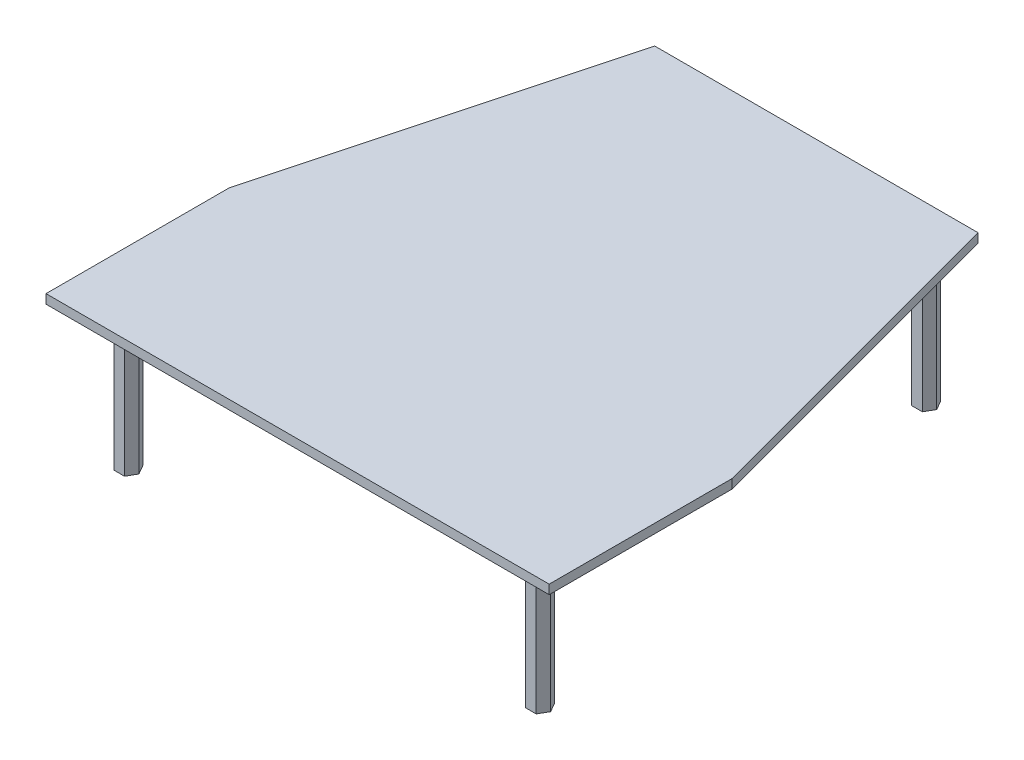
ISO-10303-21;
HEADER;
FILE_DESCRIPTION(('STEP AP214'),'2;1');
FILE_NAME('part.step','',(''),(''),'','','');
FILE_SCHEMA(('AUTOMOTIVE_DESIGN { 1 0 10303 214 1 1 1 1 }'));
ENDSEC;
DATA;
#1=APPLICATION_CONTEXT('core data for automotive mechanical design processes');
#2=APPLICATION_PROTOCOL_DEFINITION('international standard','automotive_design',2000,#1);
#3=PRODUCT_CONTEXT('',#1,'mechanical');
#4=PRODUCT('Part','Part','',(#3));
#5=PRODUCT_RELATED_PRODUCT_CATEGORY('part','',(#4));
#6=PRODUCT_DEFINITION_FORMATION('','',#4);
#7=PRODUCT_DEFINITION_CONTEXT('part definition',#1,'design');
#8=PRODUCT_DEFINITION('design','',#6,#7);
#9=PRODUCT_DEFINITION_SHAPE('','',#8);
#10=(LENGTH_UNIT() NAMED_UNIT(*) SI_UNIT(.MILLI.,.METRE.));
#11=(NAMED_UNIT(*) PLANE_ANGLE_UNIT() SI_UNIT($,.RADIAN.));
#12=(NAMED_UNIT(*) SI_UNIT($,.STERADIAN.) SOLID_ANGLE_UNIT());
#13=UNCERTAINTY_MEASURE_WITH_UNIT(LENGTH_MEASURE(1.E-05),#10,'distance_accuracy_value','');
#14=(GEOMETRIC_REPRESENTATION_CONTEXT(3) GLOBAL_UNCERTAINTY_ASSIGNED_CONTEXT((#13)) GLOBAL_UNIT_ASSIGNED_CONTEXT((#10,
#11,#12)) REPRESENTATION_CONTEXT('',''));
#15=CARTESIAN_POINT('',(0.,0.,0.));
#16=DIRECTION('',(0.,0.,1.));
#17=DIRECTION('',(1.,0.,0.));
#18=AXIS2_PLACEMENT_3D('',#15,#16,#17);
#19=CARTESIAN_POINT('',(0.,-1.,0.));
#20=DIRECTION('',(0.,-1.,0.));
#21=DIRECTION('',(0.,0.,-1.));
#22=AXIS2_PLACEMENT_3D('',#19,#20,#21);
#23=PLANE('',#22);
#24=DIRECTION('',(-0.258819045102522,0.,0.965925826289068));
#25=VECTOR('',#24,1.);
#26=CARTESIAN_POINT('',(-55.,-1.,-40.));
#27=LINE('',#26,#25);
#28=CARTESIAN_POINT('',(-35.3297525722084,-1.,-113.410362797969));
#29=VERTEX_POINT('',#28);
#30=CARTESIAN_POINT('',(-55.,-1.,-40.));
#31=VERTEX_POINT('',#30);
#32=EDGE_CURVE('E391',#29,#31,#27,.T.);
#33=ORIENTED_EDGE('',*,*,#32,.F.);
#34=DIRECTION('',(-1.,0.,0.));
#35=VECTOR('',#34,1.);
#36=CARTESIAN_POINT('',(-35.3297525722084,-1.,-113.410362797969));
#37=LINE('',#36,#35);
#38=CARTESIAN_POINT('',(35.3297525722084,-1.,-113.410362797969));
#39=VERTEX_POINT('',#38);
#40=EDGE_CURVE('E396',#39,#29,#37,.T.);
#41=ORIENTED_EDGE('',*,*,#40,.F.);
#42=DIRECTION('',(-0.258819045102522,0.,-0.965925826289068));
#43=VECTOR('',#42,1.);
#44=CARTESIAN_POINT('',(55.,-1.,-40.));
#45=LINE('',#44,#43);
#46=CARTESIAN_POINT('',(55.,-1.,-40.));
#47=VERTEX_POINT('',#46);
#48=EDGE_CURVE('E415',#47,#39,#45,.T.);
#49=ORIENTED_EDGE('',*,*,#48,.F.);
#50=DIRECTION('',(0.,0.,-1.));
#51=VECTOR('',#50,1.);
#52=CARTESIAN_POINT('',(55.,-1.,0.));
#53=LINE('',#52,#51);
#54=CARTESIAN_POINT('',(55.,-1.,0.));
#55=VERTEX_POINT('',#54);
#56=EDGE_CURVE('E413',#55,#47,#53,.T.);
#57=ORIENTED_EDGE('',*,*,#56,.F.);
#58=DIRECTION('',(1.,0.,0.));
#59=VECTOR('',#58,1.);
#60=CARTESIAN_POINT('',(-55.,-1.,0.));
#61=LINE('',#60,#59);
#62=CARTESIAN_POINT('',(-55.,-1.,0.));
#63=VERTEX_POINT('',#62);
#64=EDGE_CURVE('E411',#63,#55,#61,.T.);
#65=ORIENTED_EDGE('',*,*,#64,.F.);
#66=DIRECTION('',(0.,0.,1.));
#67=VECTOR('',#66,1.);
#68=CARTESIAN_POINT('',(-55.,-1.,0.));
#69=LINE('',#68,#67);
#70=EDGE_CURVE('E409',#31,#63,#69,.T.);
#71=ORIENTED_EDGE('',*,*,#70,.F.);
#72=EDGE_LOOP('',(#33,#41,#49,#57,#65,#71));
#73=FACE_BOUND('',#72,.T.);
#74=DIRECTION('',(-0.5,0.,0.866025403784439));
#75=VECTOR('',#74,1.);
#76=CARTESIAN_POINT('',(-42.6905989232415,-1.,-7.99999999999999));
#77=LINE('',#76,#75);
#78=CARTESIAN_POINT('',(-42.6905989232415,-1.,-7.99999999999999));
#79=VERTEX_POINT('',#78);
#80=CARTESIAN_POINT('',(-43.8452994616208,-1.,-5.99999999999997));
#81=VERTEX_POINT('',#80);
#82=EDGE_CURVE('E366',#79,#81,#77,.T.);
#83=ORIENTED_EDGE('',*,*,#82,.F.);
#84=DIRECTION('',(0.499999999999998,0.,0.86602540378444));
#85=VECTOR('',#84,1.);
#86=CARTESIAN_POINT('',(-43.8452994616208,-1.,-9.99999999999999));
#87=LINE('',#86,#85);
#88=CARTESIAN_POINT('',(-43.8452994616208,-1.,-9.99999999999999));
#89=VERTEX_POINT('',#88);
#90=EDGE_CURVE('E348',#89,#79,#87,.T.);
#91=ORIENTED_EDGE('',*,*,#90,.F.);
#92=DIRECTION('',(1.,0.,0.));
#93=VECTOR('',#92,1.);
#94=CARTESIAN_POINT('',(-46.1547005383793,-1.,-10.));
#95=LINE('',#94,#93);
#96=CARTESIAN_POINT('',(-46.1547005383793,-1.,-10.));
#97=VERTEX_POINT('',#96);
#98=EDGE_CURVE('E353',#97,#89,#95,.T.);
#99=ORIENTED_EDGE('',*,*,#98,.F.);
#100=DIRECTION('',(0.499999999999995,0.,-0.866025403784441));
#101=VECTOR('',#100,1.);
#102=CARTESIAN_POINT('',(-47.3094010767585,-1.,-7.99999999999999));
#103=LINE('',#102,#101);
#104=CARTESIAN_POINT('',(-47.3094010767585,-1.,-7.99999999999999));
#105=VERTEX_POINT('',#104);
#106=EDGE_CURVE('E372',#105,#97,#103,.T.);
#107=ORIENTED_EDGE('',*,*,#106,.F.);
#108=DIRECTION('',(-0.499999999999992,0.,-0.866025403784443));
#109=VECTOR('',#108,1.);
#110=CARTESIAN_POINT('',(-46.1547005383793,-1.,-5.99999999999998));
#111=LINE('',#110,#109);
#112=CARTESIAN_POINT('',(-46.1547005383793,-1.,-5.99999999999998));
#113=VERTEX_POINT('',#112);
#114=EDGE_CURVE('E370',#113,#105,#111,.T.);
#115=ORIENTED_EDGE('',*,*,#114,.F.);
#116=DIRECTION('',(-1.,0.,0.));
#117=VECTOR('',#116,1.);
#118=CARTESIAN_POINT('',(-43.8452994616208,-1.,-5.99999999999997));
#119=LINE('',#118,#117);
#120=EDGE_CURVE('E368',#81,#113,#119,.T.);
#121=ORIENTED_EDGE('',*,*,#120,.F.);
#122=EDGE_LOOP('',(#83,#91,#99,#107,#115,#121));
#123=FACE_BOUND('',#122,.T.);
#124=DIRECTION('',(-0.5,0.,0.866025403784439));
#125=VECTOR('',#124,1.);
#126=CARTESIAN_POINT('',(-27.6905989232415,-1.,-107.410362797969));
#127=LINE('',#126,#125);
#128=CARTESIAN_POINT('',(-27.6905989232415,-1.,-107.410362797969));
#129=VERTEX_POINT('',#128);
#130=CARTESIAN_POINT('',(-28.8452994616208,-1.,-105.410362797969));
#131=VERTEX_POINT('',#130);
#132=EDGE_CURVE('E323',#129,#131,#127,.T.);
#133=ORIENTED_EDGE('',*,*,#132,.F.);
#134=DIRECTION('',(0.500000000000001,0.,0.866025403784438));
#135=VECTOR('',#134,1.);
#136=CARTESIAN_POINT('',(-28.8452994616207,-1.,-109.410362797969));
#137=LINE('',#136,#135);
#138=CARTESIAN_POINT('',(-28.8452994616207,-1.,-109.410362797969));
#139=VERTEX_POINT('',#138);
#140=EDGE_CURVE('E305',#139,#129,#137,.T.);
#141=ORIENTED_EDGE('',*,*,#140,.F.);
#142=DIRECTION('',(1.,0.,0.));
#143=VECTOR('',#142,1.);
#144=CARTESIAN_POINT('',(-31.1547005383793,-1.,-109.410362797969));
#145=LINE('',#144,#143);
#146=CARTESIAN_POINT('',(-31.1547005383793,-1.,-109.410362797969));
#147=VERTEX_POINT('',#146);
#148=EDGE_CURVE('E310',#147,#139,#145,.T.);
#149=ORIENTED_EDGE('',*,*,#148,.F.);
#150=DIRECTION('',(0.5,0.,-0.866025403784439));
#151=VECTOR('',#150,1.);
#152=CARTESIAN_POINT('',(-32.3094010767585,-1.,-107.410362797969));
#153=LINE('',#152,#151);
#154=CARTESIAN_POINT('',(-32.3094010767585,-1.,-107.410362797969));
#155=VERTEX_POINT('',#154);
#156=EDGE_CURVE('E329',#155,#147,#153,.T.);
#157=ORIENTED_EDGE('',*,*,#156,.F.);
#158=DIRECTION('',(-0.5,0.,-0.866025403784439));
#159=VECTOR('',#158,1.);
#160=CARTESIAN_POINT('',(-31.1547005383793,-1.,-105.410362797969));
#161=LINE('',#160,#159);
#162=CARTESIAN_POINT('',(-31.1547005383793,-1.,-105.410362797969));
#163=VERTEX_POINT('',#162);
#164=EDGE_CURVE('E327',#163,#155,#161,.T.);
#165=ORIENTED_EDGE('',*,*,#164,.F.);
#166=DIRECTION('',(-1.,0.,0.));
#167=VECTOR('',#166,1.);
#168=CARTESIAN_POINT('',(-28.8452994616208,-1.,-105.410362797969));
#169=LINE('',#168,#167);
#170=EDGE_CURVE('E325',#131,#163,#169,.T.);
#171=ORIENTED_EDGE('',*,*,#170,.F.);
#172=EDGE_LOOP('',(#133,#141,#149,#157,#165,#171));
#173=FACE_BOUND('',#172,.T.);
#174=DIRECTION('',(0.5,0.,0.866025403784439));
#175=VECTOR('',#174,1.);
#176=CARTESIAN_POINT('',(32.3094010767585,-1.,-107.410362797969));
#177=LINE('',#176,#175);
#178=CARTESIAN_POINT('',(31.1547005383793,-1.,-109.410362797969));
#179=VERTEX_POINT('',#178);
#180=CARTESIAN_POINT('',(32.3094010767585,-1.,-107.410362797969));
#181=VERTEX_POINT('',#180);
#182=EDGE_CURVE('E262',#179,#181,#177,.T.);
#183=ORIENTED_EDGE('',*,*,#182,.F.);
#184=DIRECTION('',(1.,0.,0.));
#185=VECTOR('',#184,1.);
#186=CARTESIAN_POINT('',(31.1547005383793,-1.,-109.410362797969));
#187=LINE('',#186,#185);
#188=CARTESIAN_POINT('',(28.8452994616207,-1.,-109.410362797969));
#189=VERTEX_POINT('',#188);
#190=EDGE_CURVE('E259',#189,#179,#187,.T.);
#191=ORIENTED_EDGE('',*,*,#190,.F.);
#192=DIRECTION('',(0.500000000000001,0.,-0.866025403784438));
#193=VECTOR('',#192,1.);
#194=CARTESIAN_POINT('',(28.8452994616207,-1.,-109.410362797969));
#195=LINE('',#194,#193);
#196=CARTESIAN_POINT('',(27.6905989232415,-1.,-107.410362797969));
#197=VERTEX_POINT('',#196);
#198=EDGE_CURVE('E272',#197,#189,#195,.T.);
#199=ORIENTED_EDGE('',*,*,#198,.F.);
#200=DIRECTION('',(-0.5,0.,-0.866025403784439));
#201=VECTOR('',#200,1.);
#202=CARTESIAN_POINT('',(27.6905989232415,-1.,-107.410362797969));
#203=LINE('',#202,#201);
#204=CARTESIAN_POINT('',(28.8452994616208,-1.,-105.410362797969));
#205=VERTEX_POINT('',#204);
#206=EDGE_CURVE('E288',#205,#197,#203,.T.);
#207=ORIENTED_EDGE('',*,*,#206,.F.);
#208=DIRECTION('',(-1.,0.,0.));
#209=VECTOR('',#208,1.);
#210=CARTESIAN_POINT('',(28.8452994616208,-1.,-105.410362797969));
#211=LINE('',#210,#209);
#212=CARTESIAN_POINT('',(31.1547005383793,-1.,-105.410362797969));
#213=VERTEX_POINT('',#212);
#214=EDGE_CURVE('E286',#213,#205,#211,.T.);
#215=ORIENTED_EDGE('',*,*,#214,.F.);
#216=DIRECTION('',(-0.5,0.,0.866025403784439));
#217=VECTOR('',#216,1.);
#218=CARTESIAN_POINT('',(31.1547005383793,-1.,-105.410362797969));
#219=LINE('',#218,#217);
#220=EDGE_CURVE('E284',#181,#213,#219,.T.);
#221=ORIENTED_EDGE('',*,*,#220,.F.);
#222=EDGE_LOOP('',(#183,#191,#199,#207,#215,#221));
#223=FACE_BOUND('',#222,.T.);
#224=DIRECTION('',(0.499999999999995,0.,0.866025403784441));
#225=VECTOR('',#224,1.);
#226=CARTESIAN_POINT('',(47.3094010767585,-1.,-7.99999999999999));
#227=LINE('',#226,#225);
#228=CARTESIAN_POINT('',(46.1547005383793,-1.,-9.99999999999999));
#229=VERTEX_POINT('',#228);
#230=CARTESIAN_POINT('',(47.3094010767585,-1.,-7.99999999999999));
#231=VERTEX_POINT('',#230);
#232=EDGE_CURVE('E802',#229,#231,#227,.T.);
#233=ORIENTED_EDGE('',*,*,#232,.F.);
#234=DIRECTION('',(1.,0.,0.));
#235=VECTOR('',#234,1.);
#236=CARTESIAN_POINT('',(46.1547005383793,-1.,-9.99999999999999));
#237=LINE('',#236,#235);
#238=CARTESIAN_POINT('',(43.8452994616208,-1.,-9.99999999999999));
#239=VERTEX_POINT('',#238);
#240=EDGE_CURVE('E257',#239,#229,#237,.T.);
#241=ORIENTED_EDGE('',*,*,#240,.F.);
#242=DIRECTION('',(0.499999999999998,0.,-0.86602540378444));
#243=VECTOR('',#242,1.);
#244=CARTESIAN_POINT('',(43.8452994616208,-1.,-9.99999999999999));
#245=LINE('',#244,#243);
#246=CARTESIAN_POINT('',(42.6905989232415,-1.,-7.99999999999999));
#247=VERTEX_POINT('',#246);
#248=EDGE_CURVE('E253',#247,#239,#245,.T.);
#249=ORIENTED_EDGE('',*,*,#248,.F.);
#250=DIRECTION('',(-0.500000000000001,0.,-0.866025403784438));
#251=VECTOR('',#250,1.);
#252=CARTESIAN_POINT('',(42.6905989232415,-1.,-7.99999999999999));
#253=LINE('',#252,#251);
#254=CARTESIAN_POINT('',(43.8452994616208,-1.,-5.99999999999997));
#255=VERTEX_POINT('',#254);
#256=EDGE_CURVE('E798',#255,#247,#253,.T.);
#257=ORIENTED_EDGE('',*,*,#256,.F.);
#258=DIRECTION('',(-1.,0.,0.));
#259=VECTOR('',#258,1.);
#260=CARTESIAN_POINT('',(43.8452994616208,-1.,-5.99999999999997));
#261=LINE('',#260,#259);
#262=CARTESIAN_POINT('',(46.1547005383793,-1.,-5.99999999999997));
#263=VERTEX_POINT('',#262);
#264=EDGE_CURVE('E810',#263,#255,#261,.T.);
#265=ORIENTED_EDGE('',*,*,#264,.F.);
#266=DIRECTION('',(-0.499999999999993,0.,0.866025403784443));
#267=VECTOR('',#266,1.);
#268=CARTESIAN_POINT('',(46.1547005383793,-1.,-5.99999999999997));
#269=LINE('',#268,#267);
#270=EDGE_CURVE('E804',#231,#263,#269,.T.);
#271=ORIENTED_EDGE('',*,*,#270,.F.);
#272=EDGE_LOOP('',(#233,#241,#249,#257,#265,#271));
#273=FACE_BOUND('',#272,.T.);
#274=ADVANCED_FACE('F36',(#73,#123,#173,#223,#273),#23,.T.);
#275=CARTESIAN_POINT('',(-55.,1.,-40.));
#276=DIRECTION('',(0.965925826289068,0.,0.258819045102522));
#277=DIRECTION('',(0.258819045102522,0.,-0.965925826289068));
#278=AXIS2_PLACEMENT_3D('',#275,#276,#277);
#279=PLANE('',#278);
#280=ORIENTED_EDGE('',*,*,#32,.T.);
#281=DIRECTION('',(0.,-1.,0.));
#282=VECTOR('',#281,1.);
#283=CARTESIAN_POINT('',(-55.,1.,-40.));
#284=LINE('',#283,#282);
#285=CARTESIAN_POINT('',(-55.,1.,-40.));
#286=VERTEX_POINT('',#285);
#287=EDGE_CURVE('E11',#286,#31,#284,.T.);
#288=ORIENTED_EDGE('',*,*,#287,.F.);
#289=DIRECTION('',(-0.258819045102522,0.,0.965925826289068));
#290=VECTOR('',#289,1.);
#291=CARTESIAN_POINT('',(-55.,1.,-40.));
#292=LINE('',#291,#290);
#293=CARTESIAN_POINT('',(-35.3297525722084,1.,-113.410362797969));
#294=VERTEX_POINT('',#293);
#295=EDGE_CURVE('E392',#294,#286,#292,.T.);
#296=ORIENTED_EDGE('',*,*,#295,.F.);
#297=DIRECTION('',(0.,-1.,0.));
#298=VECTOR('',#297,1.);
#299=CARTESIAN_POINT('',(-35.3297525722084,1.,-113.410362797969));
#300=LINE('',#299,#298);
#301=EDGE_CURVE('E406',#294,#29,#300,.T.);
#302=ORIENTED_EDGE('',*,*,#301,.T.);
#303=EDGE_LOOP('',(#280,#288,#296,#302));
#304=FACE_BOUND('',#303,.T.);
#305=ADVANCED_FACE('F38',(#304),#279,.F.);
#306=CARTESIAN_POINT('',(-55.,1.,0.));
#307=DIRECTION('',(1.,0.,0.));
#308=DIRECTION('',(0.,0.,-1.));
#309=AXIS2_PLACEMENT_3D('',#306,#307,#308);
#310=PLANE('',#309);
#311=ORIENTED_EDGE('',*,*,#70,.T.);
#312=DIRECTION('',(0.,-1.,0.));
#313=VECTOR('',#312,1.);
#314=CARTESIAN_POINT('',(-55.,1.,0.));
#315=LINE('',#314,#313);
#316=CARTESIAN_POINT('',(-55.,1.,0.));
#317=VERTEX_POINT('',#316);
#318=EDGE_CURVE('E44',#317,#63,#315,.T.);
#319=ORIENTED_EDGE('',*,*,#318,.F.);
#320=DIRECTION('',(0.,0.,1.));
#321=VECTOR('',#320,1.);
#322=CARTESIAN_POINT('',(-55.,1.,0.));
#323=LINE('',#322,#321);
#324=EDGE_CURVE('E395',#286,#317,#323,.T.);
#325=ORIENTED_EDGE('',*,*,#324,.F.);
#326=ORIENTED_EDGE('',*,*,#287,.T.);
#327=EDGE_LOOP('',(#311,#319,#325,#326));
#328=FACE_BOUND('',#327,.T.);
#329=ADVANCED_FACE('F456',(#328),#310,.F.);
#330=CARTESIAN_POINT('',(-55.,1.,0.));
#331=DIRECTION('',(0.,0.,-1.));
#332=DIRECTION('',(-1.,0.,0.));
#333=AXIS2_PLACEMENT_3D('',#330,#331,#332);
#334=PLANE('',#333);
#335=ORIENTED_EDGE('',*,*,#64,.T.);
#336=DIRECTION('',(0.,-1.,0.));
#337=VECTOR('',#336,1.);
#338=CARTESIAN_POINT('',(55.,1.,0.));
#339=LINE('',#338,#337);
#340=CARTESIAN_POINT('',(55.,1.,0.));
#341=VERTEX_POINT('',#340);
#342=EDGE_CURVE('E426',#341,#55,#339,.T.);
#343=ORIENTED_EDGE('',*,*,#342,.F.);
#344=DIRECTION('',(1.,0.,0.));
#345=VECTOR('',#344,1.);
#346=CARTESIAN_POINT('',(-55.,1.,0.));
#347=LINE('',#346,#345);
#348=EDGE_CURVE('E398',#317,#341,#347,.T.);
#349=ORIENTED_EDGE('',*,*,#348,.F.);
#350=ORIENTED_EDGE('',*,*,#318,.T.);
#351=EDGE_LOOP('',(#335,#343,#349,#350));
#352=FACE_BOUND('',#351,.T.);
#353=ADVANCED_FACE('F433',(#352),#334,.F.);
#354=CARTESIAN_POINT('',(55.,1.,0.));
#355=DIRECTION('',(-1.,0.,0.));
#356=DIRECTION('',(0.,0.,1.));
#357=AXIS2_PLACEMENT_3D('',#354,#355,#356);
#358=PLANE('',#357);
#359=ORIENTED_EDGE('',*,*,#56,.T.);
#360=DIRECTION('',(0.,-1.,0.));
#361=VECTOR('',#360,1.);
#362=CARTESIAN_POINT('',(55.,1.,-40.));
#363=LINE('',#362,#361);
#364=CARTESIAN_POINT('',(55.,1.,-40.));
#365=VERTEX_POINT('',#364);
#366=EDGE_CURVE('E423',#365,#47,#363,.T.);
#367=ORIENTED_EDGE('',*,*,#366,.F.);
#368=DIRECTION('',(0.,0.,-1.));
#369=VECTOR('',#368,1.);
#370=CARTESIAN_POINT('',(55.,1.,0.));
#371=LINE('',#370,#369);
#372=EDGE_CURVE('E400',#341,#365,#371,.T.);
#373=ORIENTED_EDGE('',*,*,#372,.F.);
#374=ORIENTED_EDGE('',*,*,#342,.T.);
#375=EDGE_LOOP('',(#359,#367,#373,#374));
#376=FACE_BOUND('',#375,.T.);
#377=ADVANCED_FACE('F444',(#376),#358,.F.);
#378=CARTESIAN_POINT('',(55.,1.,-40.));
#379=DIRECTION('',(-0.965925826289068,0.,0.258819045102522));
#380=DIRECTION('',(0.258819045102522,0.,0.965925826289068));
#381=AXIS2_PLACEMENT_3D('',#378,#379,#380);
#382=PLANE('',#381);
#383=ORIENTED_EDGE('',*,*,#48,.T.);
#384=DIRECTION('',(0.,-1.,0.));
#385=VECTOR('',#384,1.);
#386=CARTESIAN_POINT('',(35.3297525722084,1.,-113.410362797969));
#387=LINE('',#386,#385);
#388=CARTESIAN_POINT('',(35.3297525722084,1.,-113.410362797969));
#389=VERTEX_POINT('',#388);
#390=EDGE_CURVE('E420',#389,#39,#387,.T.);
#391=ORIENTED_EDGE('',*,*,#390,.F.);
#392=DIRECTION('',(-0.258819045102522,0.,-0.965925826289068));
#393=VECTOR('',#392,1.);
#394=CARTESIAN_POINT('',(55.,1.,-40.));
#395=LINE('',#394,#393);
#396=EDGE_CURVE('E402',#365,#389,#395,.T.);
#397=ORIENTED_EDGE('',*,*,#396,.F.);
#398=ORIENTED_EDGE('',*,*,#366,.T.);
#399=EDGE_LOOP('',(#383,#391,#397,#398));
#400=FACE_BOUND('',#399,.T.);
#401=ADVANCED_FACE('F448',(#400),#382,.F.);
#402=CARTESIAN_POINT('',(-35.3297525722084,1.,-113.410362797969));
#403=DIRECTION('',(0.,0.,1.));
#404=DIRECTION('',(1.,0.,0.));
#405=AXIS2_PLACEMENT_3D('',#402,#403,#404);
#406=PLANE('',#405);
#407=ORIENTED_EDGE('',*,*,#40,.T.);
#408=ORIENTED_EDGE('',*,*,#301,.F.);
#409=DIRECTION('',(-1.,0.,0.));
#410=VECTOR('',#409,1.);
#411=CARTESIAN_POINT('',(-35.3297525722084,1.,-113.410362797969));
#412=LINE('',#411,#410);
#413=EDGE_CURVE('E404',#389,#294,#412,.T.);
#414=ORIENTED_EDGE('',*,*,#413,.F.);
#415=ORIENTED_EDGE('',*,*,#390,.T.);
#416=EDGE_LOOP('',(#407,#408,#414,#415));
#417=FACE_BOUND('',#416,.T.);
#418=ADVANCED_FACE('F459',(#417),#406,.F.);
#419=CARTESIAN_POINT('',(0.,1.,0.));
#420=DIRECTION('',(0.,-1.,0.));
#421=DIRECTION('',(0.,0.,-1.));
#422=AXIS2_PLACEMENT_3D('',#419,#420,#421);
#423=PLANE('',#422);
#424=ORIENTED_EDGE('',*,*,#295,.T.);
#425=ORIENTED_EDGE('',*,*,#324,.T.);
#426=ORIENTED_EDGE('',*,*,#348,.T.);
#427=ORIENTED_EDGE('',*,*,#372,.T.);
#428=ORIENTED_EDGE('',*,*,#396,.T.);
#429=ORIENTED_EDGE('',*,*,#413,.T.);
#430=EDGE_LOOP('',(#424,#425,#426,#427,#428,#429));
#431=FACE_BOUND('',#430,.T.);
#432=ADVANCED_FACE('F452',(#431),#423,.F.);
#433=CARTESIAN_POINT('',(-43.8452994616208,-31.,-9.99999999999999));
#434=DIRECTION('',(-0.86602540378444,0.,0.499999999999998));
#435=DIRECTION('',(0.499999999999998,0.,0.86602540378444));
#436=AXIS2_PLACEMENT_3D('',#433,#434,#435);
#437=PLANE('',#436);
#438=ORIENTED_EDGE('',*,*,#90,.T.);
#439=DIRECTION('',(0.,1.,0.));
#440=VECTOR('',#439,1.);
#441=CARTESIAN_POINT('',(-42.6905989232415,-31.,-7.99999999999999));
#442=LINE('',#441,#440);
#443=CARTESIAN_POINT('',(-42.6905989232415,-31.,-7.99999999999999));
#444=VERTEX_POINT('',#443);
#445=EDGE_CURVE('E389',#444,#79,#442,.T.);
#446=ORIENTED_EDGE('',*,*,#445,.F.);
#447=DIRECTION('',(0.499999999999998,0.,0.86602540378444));
#448=VECTOR('',#447,1.);
#449=CARTESIAN_POINT('',(-43.8452994616208,-31.,-9.99999999999999));
#450=LINE('',#449,#448);
#451=CARTESIAN_POINT('',(-43.8452994616208,-31.,-9.99999999999999));
#452=VERTEX_POINT('',#451);
#453=EDGE_CURVE('E349',#452,#444,#450,.T.);
#454=ORIENTED_EDGE('',*,*,#453,.F.);
#455=DIRECTION('',(0.,1.,0.));
#456=VECTOR('',#455,1.);
#457=CARTESIAN_POINT('',(-43.8452994616208,-31.,-9.99999999999999));
#458=LINE('',#457,#456);
#459=EDGE_CURVE('E363',#452,#89,#458,.T.);
#460=ORIENTED_EDGE('',*,*,#459,.T.);
#461=EDGE_LOOP('',(#438,#446,#454,#460));
#462=FACE_BOUND('',#461,.T.);
#463=ADVANCED_FACE('F466',(#462),#437,.F.);
#464=CARTESIAN_POINT('',(-42.6905989232415,-31.,-7.99999999999999));
#465=DIRECTION('',(-0.866025403784438,0.,-0.5));
#466=DIRECTION('',(-0.5,0.,0.866025403784439));
#467=AXIS2_PLACEMENT_3D('',#464,#465,#466);
#468=PLANE('',#467);
#469=ORIENTED_EDGE('',*,*,#82,.T.);
#470=DIRECTION('',(0.,1.,0.));
#471=VECTOR('',#470,1.);
#472=CARTESIAN_POINT('',(-43.8452994616208,-31.,-5.99999999999997));
#473=LINE('',#472,#471);
#474=CARTESIAN_POINT('',(-43.8452994616208,-31.,-5.99999999999997));
#475=VERTEX_POINT('',#474);
#476=EDGE_CURVE('E386',#475,#81,#473,.T.);
#477=ORIENTED_EDGE('',*,*,#476,.F.);
#478=DIRECTION('',(-0.5,0.,0.866025403784439));
#479=VECTOR('',#478,1.);
#480=CARTESIAN_POINT('',(-42.6905989232415,-31.,-7.99999999999999));
#481=LINE('',#480,#479);
#482=EDGE_CURVE('E352',#444,#475,#481,.T.);
#483=ORIENTED_EDGE('',*,*,#482,.F.);
#484=ORIENTED_EDGE('',*,*,#445,.T.);
#485=EDGE_LOOP('',(#469,#477,#483,#484));
#486=FACE_BOUND('',#485,.T.);
#487=ADVANCED_FACE('F477',(#486),#468,.F.);
#488=CARTESIAN_POINT('',(-43.8452994616208,-31.,-5.99999999999997));
#489=DIRECTION('',(0.,0.,-1.));
#490=DIRECTION('',(-1.,0.,0.));
#491=AXIS2_PLACEMENT_3D('',#488,#489,#490);
#492=PLANE('',#491);
#493=ORIENTED_EDGE('',*,*,#120,.T.);
#494=DIRECTION('',(0.,1.,0.));
#495=VECTOR('',#494,1.);
#496=CARTESIAN_POINT('',(-46.1547005383793,-31.,-5.99999999999998));
#497=LINE('',#496,#495);
#498=CARTESIAN_POINT('',(-46.1547005383793,-31.,-5.99999999999998));
#499=VERTEX_POINT('',#498);
#500=EDGE_CURVE('E383',#499,#113,#497,.T.);
#501=ORIENTED_EDGE('',*,*,#500,.F.);
#502=DIRECTION('',(-1.,0.,0.));
#503=VECTOR('',#502,1.);
#504=CARTESIAN_POINT('',(-43.8452994616208,-31.,-5.99999999999997));
#505=LINE('',#504,#503);
#506=EDGE_CURVE('E355',#475,#499,#505,.T.);
#507=ORIENTED_EDGE('',*,*,#506,.F.);
#508=ORIENTED_EDGE('',*,*,#476,.T.);
#509=EDGE_LOOP('',(#493,#501,#507,#508));
#510=FACE_BOUND('',#509,.T.);
#511=ADVANCED_FACE('F481',(#510),#492,.F.);
#512=CARTESIAN_POINT('',(-46.1547005383793,-31.,-5.99999999999998));
#513=DIRECTION('',(0.866025403784443,0.,-0.499999999999992));
#514=DIRECTION('',(-0.499999999999992,0.,-0.866025403784443));
#515=AXIS2_PLACEMENT_3D('',#512,#513,#514);
#516=PLANE('',#515);
#517=ORIENTED_EDGE('',*,*,#114,.T.);
#518=DIRECTION('',(0.,1.,0.));
#519=VECTOR('',#518,1.);
#520=CARTESIAN_POINT('',(-47.3094010767585,-31.,-7.99999999999999));
#521=LINE('',#520,#519);
#522=CARTESIAN_POINT('',(-47.3094010767585,-31.,-7.99999999999999));
#523=VERTEX_POINT('',#522);
#524=EDGE_CURVE('E380',#523,#105,#521,.T.);
#525=ORIENTED_EDGE('',*,*,#524,.F.);
#526=DIRECTION('',(-0.499999999999992,0.,-0.866025403784443));
#527=VECTOR('',#526,1.);
#528=CARTESIAN_POINT('',(-46.1547005383793,-31.,-5.99999999999998));
#529=LINE('',#528,#527);
#530=EDGE_CURVE('E357',#499,#523,#529,.T.);
#531=ORIENTED_EDGE('',*,*,#530,.F.);
#532=ORIENTED_EDGE('',*,*,#500,.T.);
#533=EDGE_LOOP('',(#517,#525,#531,#532));
#534=FACE_BOUND('',#533,.T.);
#535=ADVANCED_FACE('F485',(#534),#516,.F.);
#536=CARTESIAN_POINT('',(-47.3094010767585,-31.,-7.99999999999999));
#537=DIRECTION('',(0.866025403784441,0.,0.499999999999995));
#538=DIRECTION('',(0.499999999999995,0.,-0.866025403784442));
#539=AXIS2_PLACEMENT_3D('',#536,#537,#538);
#540=PLANE('',#539);
#541=ORIENTED_EDGE('',*,*,#106,.T.);
#542=DIRECTION('',(0.,1.,0.));
#543=VECTOR('',#542,1.);
#544=CARTESIAN_POINT('',(-46.1547005383793,-31.,-10.));
#545=LINE('',#544,#543);
#546=CARTESIAN_POINT('',(-46.1547005383793,-31.,-10.));
#547=VERTEX_POINT('',#546);
#548=EDGE_CURVE('E378',#547,#97,#545,.T.);
#549=ORIENTED_EDGE('',*,*,#548,.F.);
#550=DIRECTION('',(0.499999999999995,0.,-0.866025403784441));
#551=VECTOR('',#550,1.);
#552=CARTESIAN_POINT('',(-47.3094010767585,-31.,-7.99999999999999));
#553=LINE('',#552,#551);
#554=EDGE_CURVE('E359',#523,#547,#553,.T.);
#555=ORIENTED_EDGE('',*,*,#554,.F.);
#556=ORIENTED_EDGE('',*,*,#524,.T.);
#557=EDGE_LOOP('',(#541,#549,#555,#556));
#558=FACE_BOUND('',#557,.T.);
#559=ADVANCED_FACE('F489',(#558),#540,.F.);
#560=CARTESIAN_POINT('',(-46.1547005383793,-31.,-10.));
#561=DIRECTION('',(0.,0.,1.));
#562=DIRECTION('',(1.,0.,0.));
#563=AXIS2_PLACEMENT_3D('',#560,#561,#562);
#564=PLANE('',#563);
#565=ORIENTED_EDGE('',*,*,#98,.T.);
#566=ORIENTED_EDGE('',*,*,#459,.F.);
#567=DIRECTION('',(1.,0.,0.));
#568=VECTOR('',#567,1.);
#569=CARTESIAN_POINT('',(-46.1547005383793,-31.,-10.));
#570=LINE('',#569,#568);
#571=EDGE_CURVE('E361',#547,#452,#570,.T.);
#572=ORIENTED_EDGE('',*,*,#571,.F.);
#573=ORIENTED_EDGE('',*,*,#548,.T.);
#574=EDGE_LOOP('',(#565,#566,#572,#573));
#575=FACE_BOUND('',#574,.T.);
#576=ADVANCED_FACE('F493',(#575),#564,.F.);
#577=CARTESIAN_POINT('',(0.,-31.,0.));
#578=DIRECTION('',(0.,-1.,0.));
#579=DIRECTION('',(0.,0.,-1.));
#580=AXIS2_PLACEMENT_3D('',#577,#578,#579);
#581=PLANE('',#580);
#582=ORIENTED_EDGE('',*,*,#453,.T.);
#583=ORIENTED_EDGE('',*,*,#482,.T.);
#584=ORIENTED_EDGE('',*,*,#506,.T.);
#585=ORIENTED_EDGE('',*,*,#530,.T.);
#586=ORIENTED_EDGE('',*,*,#554,.T.);
#587=ORIENTED_EDGE('',*,*,#571,.T.);
#588=EDGE_LOOP('',(#582,#583,#584,#585,#586,#587));
#589=FACE_BOUND('',#588,.T.);
#590=ADVANCED_FACE('F497',(#589),#581,.T.);
#591=CARTESIAN_POINT('',(-28.8452994616207,-31.,-109.410362797969));
#592=DIRECTION('',(-0.866025403784438,0.,0.500000000000001));
#593=DIRECTION('',(0.500000000000001,0.,0.866025403784438));
#594=AXIS2_PLACEMENT_3D('',#591,#592,#593);
#595=PLANE('',#594);
#596=ORIENTED_EDGE('',*,*,#140,.T.);
#597=DIRECTION('',(0.,1.,0.));
#598=VECTOR('',#597,1.);
#599=CARTESIAN_POINT('',(-27.6905989232415,-31.,-107.410362797969));
#600=LINE('',#599,#598);
#601=CARTESIAN_POINT('',(-27.6905989232415,-31.,-107.410362797969));
#602=VERTEX_POINT('',#601);
#603=EDGE_CURVE('E346',#602,#129,#600,.T.);
#604=ORIENTED_EDGE('',*,*,#603,.F.);
#605=DIRECTION('',(0.500000000000001,0.,0.866025403784438));
#606=VECTOR('',#605,1.);
#607=CARTESIAN_POINT('',(-28.8452994616207,-31.,-109.410362797969));
#608=LINE('',#607,#606);
#609=CARTESIAN_POINT('',(-28.8452994616207,-31.,-109.410362797969));
#610=VERTEX_POINT('',#609);
#611=EDGE_CURVE('E306',#610,#602,#608,.T.);
#612=ORIENTED_EDGE('',*,*,#611,.F.);
#613=DIRECTION('',(0.,1.,0.));
#614=VECTOR('',#613,1.);
#615=CARTESIAN_POINT('',(-28.8452994616207,-31.,-109.410362797969));
#616=LINE('',#615,#614);
#617=EDGE_CURVE('E320',#610,#139,#616,.T.);
#618=ORIENTED_EDGE('',*,*,#617,.T.);
#619=EDGE_LOOP('',(#596,#604,#612,#618));
#620=FACE_BOUND('',#619,.T.);
#621=ADVANCED_FACE('F501',(#620),#595,.F.);
#622=CARTESIAN_POINT('',(-27.6905989232415,-31.,-107.410362797969));
#623=DIRECTION('',(-0.866025403784439,0.,-0.5));
#624=DIRECTION('',(-0.5,0.,0.866025403784439));
#625=AXIS2_PLACEMENT_3D('',#622,#623,#624);
#626=PLANE('',#625);
#627=ORIENTED_EDGE('',*,*,#132,.T.);
#628=DIRECTION('',(0.,1.,0.));
#629=VECTOR('',#628,1.);
#630=CARTESIAN_POINT('',(-28.8452994616208,-31.,-105.410362797969));
#631=LINE('',#630,#629);
#632=CARTESIAN_POINT('',(-28.8452994616208,-31.,-105.410362797969));
#633=VERTEX_POINT('',#632);
#634=EDGE_CURVE('E343',#633,#131,#631,.T.);
#635=ORIENTED_EDGE('',*,*,#634,.F.);
#636=DIRECTION('',(-0.5,0.,0.866025403784439));
#637=VECTOR('',#636,1.);
#638=CARTESIAN_POINT('',(-27.6905989232415,-31.,-107.410362797969));
#639=LINE('',#638,#637);
#640=EDGE_CURVE('E309',#602,#633,#639,.T.);
#641=ORIENTED_EDGE('',*,*,#640,.F.);
#642=ORIENTED_EDGE('',*,*,#603,.T.);
#643=EDGE_LOOP('',(#627,#635,#641,#642));
#644=FACE_BOUND('',#643,.T.);
#645=ADVANCED_FACE('F505',(#644),#626,.F.);
#646=CARTESIAN_POINT('',(-28.8452994616208,-31.,-105.410362797969));
#647=DIRECTION('',(0.,0.,-1.));
#648=DIRECTION('',(-1.,0.,0.));
#649=AXIS2_PLACEMENT_3D('',#646,#647,#648);
#650=PLANE('',#649);
#651=ORIENTED_EDGE('',*,*,#170,.T.);
#652=DIRECTION('',(0.,1.,0.));
#653=VECTOR('',#652,1.);
#654=CARTESIAN_POINT('',(-31.1547005383793,-31.,-105.410362797969));
#655=LINE('',#654,#653);
#656=CARTESIAN_POINT('',(-31.1547005383793,-31.,-105.410362797969));
#657=VERTEX_POINT('',#656);
#658=EDGE_CURVE('E340',#657,#163,#655,.T.);
#659=ORIENTED_EDGE('',*,*,#658,.F.);
#660=DIRECTION('',(-1.,0.,0.));
#661=VECTOR('',#660,1.);
#662=CARTESIAN_POINT('',(-28.8452994616208,-31.,-105.410362797969));
#663=LINE('',#662,#661);
#664=EDGE_CURVE('E312',#633,#657,#663,.T.);
#665=ORIENTED_EDGE('',*,*,#664,.F.);
#666=ORIENTED_EDGE('',*,*,#634,.T.);
#667=EDGE_LOOP('',(#651,#659,#665,#666));
#668=FACE_BOUND('',#667,.T.);
#669=ADVANCED_FACE('F509',(#668),#650,.F.);
#670=CARTESIAN_POINT('',(-31.1547005383793,-31.,-105.410362797969));
#671=DIRECTION('',(0.866025403784439,0.,-0.5));
#672=DIRECTION('',(-0.5,0.,-0.866025403784439));
#673=AXIS2_PLACEMENT_3D('',#670,#671,#672);
#674=PLANE('',#673);
#675=ORIENTED_EDGE('',*,*,#164,.T.);
#676=DIRECTION('',(0.,1.,0.));
#677=VECTOR('',#676,1.);
#678=CARTESIAN_POINT('',(-32.3094010767585,-31.,-107.410362797969));
#679=LINE('',#678,#677);
#680=CARTESIAN_POINT('',(-32.3094010767585,-31.,-107.410362797969));
#681=VERTEX_POINT('',#680);
#682=EDGE_CURVE('E337',#681,#155,#679,.T.);
#683=ORIENTED_EDGE('',*,*,#682,.F.);
#684=DIRECTION('',(-0.5,0.,-0.866025403784439));
#685=VECTOR('',#684,1.);
#686=CARTESIAN_POINT('',(-31.1547005383793,-31.,-105.410362797969));
#687=LINE('',#686,#685);
#688=EDGE_CURVE('E314',#657,#681,#687,.T.);
#689=ORIENTED_EDGE('',*,*,#688,.F.);
#690=ORIENTED_EDGE('',*,*,#658,.T.);
#691=EDGE_LOOP('',(#675,#683,#689,#690));
#692=FACE_BOUND('',#691,.T.);
#693=ADVANCED_FACE('F513',(#692),#674,.F.);
#694=CARTESIAN_POINT('',(-32.3094010767585,-31.,-107.410362797969));
#695=DIRECTION('',(0.866025403784439,0.,0.5));
#696=DIRECTION('',(0.5,0.,-0.866025403784439));
#697=AXIS2_PLACEMENT_3D('',#694,#695,#696);
#698=PLANE('',#697);
#699=ORIENTED_EDGE('',*,*,#156,.T.);
#700=DIRECTION('',(0.,1.,0.));
#701=VECTOR('',#700,1.);
#702=CARTESIAN_POINT('',(-31.1547005383793,-31.,-109.410362797969));
#703=LINE('',#702,#701);
#704=CARTESIAN_POINT('',(-31.1547005383793,-31.,-109.410362797969));
#705=VERTEX_POINT('',#704);
#706=EDGE_CURVE('E335',#705,#147,#703,.T.);
#707=ORIENTED_EDGE('',*,*,#706,.F.);
#708=DIRECTION('',(0.5,0.,-0.866025403784439));
#709=VECTOR('',#708,1.);
#710=CARTESIAN_POINT('',(-32.3094010767585,-31.,-107.410362797969));
#711=LINE('',#710,#709);
#712=EDGE_CURVE('E316',#681,#705,#711,.T.);
#713=ORIENTED_EDGE('',*,*,#712,.F.);
#714=ORIENTED_EDGE('',*,*,#682,.T.);
#715=EDGE_LOOP('',(#699,#707,#713,#714));
#716=FACE_BOUND('',#715,.T.);
#717=ADVANCED_FACE('F517',(#716),#698,.F.);
#718=CARTESIAN_POINT('',(-31.1547005383793,-31.,-109.410362797969));
#719=DIRECTION('',(0.,0.,1.));
#720=DIRECTION('',(1.,0.,0.));
#721=AXIS2_PLACEMENT_3D('',#718,#719,#720);
#722=PLANE('',#721);
#723=ORIENTED_EDGE('',*,*,#148,.T.);
#724=ORIENTED_EDGE('',*,*,#617,.F.);
#725=DIRECTION('',(1.,0.,0.));
#726=VECTOR('',#725,1.);
#727=CARTESIAN_POINT('',(-31.1547005383793,-31.,-109.410362797969));
#728=LINE('',#727,#726);
#729=EDGE_CURVE('E318',#705,#610,#728,.T.);
#730=ORIENTED_EDGE('',*,*,#729,.F.);
#731=ORIENTED_EDGE('',*,*,#706,.T.);
#732=EDGE_LOOP('',(#723,#724,#730,#731));
#733=FACE_BOUND('',#732,.T.);
#734=ADVANCED_FACE('F521',(#733),#722,.F.);
#735=CARTESIAN_POINT('',(0.,-31.,0.));
#736=DIRECTION('',(0.,-1.,0.));
#737=DIRECTION('',(0.,0.,-1.));
#738=AXIS2_PLACEMENT_3D('',#735,#736,#737);
#739=PLANE('',#738);
#740=ORIENTED_EDGE('',*,*,#611,.T.);
#741=ORIENTED_EDGE('',*,*,#640,.T.);
#742=ORIENTED_EDGE('',*,*,#664,.T.);
#743=ORIENTED_EDGE('',*,*,#688,.T.);
#744=ORIENTED_EDGE('',*,*,#712,.T.);
#745=ORIENTED_EDGE('',*,*,#729,.T.);
#746=EDGE_LOOP('',(#740,#741,#742,#743,#744,#745));
#747=FACE_BOUND('',#746,.T.);
#748=ADVANCED_FACE('F525',(#747),#739,.T.);
#749=CARTESIAN_POINT('',(31.1547005383793,-31.,-109.410362797969));
#750=DIRECTION('',(0.,0.,1.));
#751=DIRECTION('',(1.,0.,0.));
#752=AXIS2_PLACEMENT_3D('',#749,#750,#751);
#753=PLANE('',#752);
#754=ORIENTED_EDGE('',*,*,#190,.T.);
#755=DIRECTION('',(0.,1.,0.));
#756=VECTOR('',#755,1.);
#757=CARTESIAN_POINT('',(31.1547005383793,-31.,-109.410362797969));
#758=LINE('',#757,#756);
#759=CARTESIAN_POINT('',(31.1547005383793,-31.,-109.410362797969));
#760=VERTEX_POINT('',#759);
#761=EDGE_CURVE('E303',#760,#179,#758,.T.);
#762=ORIENTED_EDGE('',*,*,#761,.F.);
#763=DIRECTION('',(1.,0.,0.));
#764=VECTOR('',#763,1.);
#765=CARTESIAN_POINT('',(31.1547005383793,-31.,-109.410362797969));
#766=LINE('',#765,#764);
#767=CARTESIAN_POINT('',(28.8452994616207,-31.,-109.410362797969));
#768=VERTEX_POINT('',#767);
#769=EDGE_CURVE('E268',#768,#760,#766,.T.);
#770=ORIENTED_EDGE('',*,*,#769,.F.);
#771=DIRECTION('',(0.,1.,0.));
#772=VECTOR('',#771,1.);
#773=CARTESIAN_POINT('',(28.8452994616207,-31.,-109.410362797969));
#774=LINE('',#773,#772);
#775=EDGE_CURVE('E281',#768,#189,#774,.T.);
#776=ORIENTED_EDGE('',*,*,#775,.T.);
#777=EDGE_LOOP('',(#754,#762,#770,#776));
#778=FACE_BOUND('',#777,.T.);
#779=ADVANCED_FACE('F529',(#778),#753,.F.);
#780=CARTESIAN_POINT('',(32.3094010767585,-31.,-107.410362797969));
#781=DIRECTION('',(-0.866025403784439,0.,0.5));
#782=DIRECTION('',(0.5,0.,0.866025403784439));
#783=AXIS2_PLACEMENT_3D('',#780,#781,#782);
#784=PLANE('',#783);
#785=ORIENTED_EDGE('',*,*,#182,.T.);
#786=DIRECTION('',(0.,1.,0.));
#787=VECTOR('',#786,1.);
#788=CARTESIAN_POINT('',(32.3094010767585,-31.,-107.410362797969));
#789=LINE('',#788,#787);
#790=CARTESIAN_POINT('',(32.3094010767585,-31.,-107.410362797969));
#791=VERTEX_POINT('',#790);
#792=EDGE_CURVE('E300',#791,#181,#789,.T.);
#793=ORIENTED_EDGE('',*,*,#792,.F.);
#794=DIRECTION('',(0.5,0.,0.866025403784439));
#795=VECTOR('',#794,1.);
#796=CARTESIAN_POINT('',(32.3094010767585,-31.,-107.410362797969));
#797=LINE('',#796,#795);
#798=EDGE_CURVE('E271',#760,#791,#797,.T.);
#799=ORIENTED_EDGE('',*,*,#798,.F.);
#800=ORIENTED_EDGE('',*,*,#761,.T.);
#801=EDGE_LOOP('',(#785,#793,#799,#800));
#802=FACE_BOUND('',#801,.T.);
#803=ADVANCED_FACE('F533',(#802),#784,.F.);
#804=CARTESIAN_POINT('',(31.1547005383793,-31.,-105.410362797969));
#805=DIRECTION('',(-0.866025403784439,0.,-0.5));
#806=DIRECTION('',(-0.5,0.,0.866025403784439));
#807=AXIS2_PLACEMENT_3D('',#804,#805,#806);
#808=PLANE('',#807);
#809=ORIENTED_EDGE('',*,*,#220,.T.);
#810=DIRECTION('',(0.,1.,0.));
#811=VECTOR('',#810,1.);
#812=CARTESIAN_POINT('',(31.1547005383793,-31.,-105.410362797969));
#813=LINE('',#812,#811);
#814=CARTESIAN_POINT('',(31.1547005383793,-31.,-105.410362797969));
#815=VERTEX_POINT('',#814);
#816=EDGE_CURVE('E297',#815,#213,#813,.T.);
#817=ORIENTED_EDGE('',*,*,#816,.F.);
#818=DIRECTION('',(-0.5,0.,0.866025403784439));
#819=VECTOR('',#818,1.);
#820=CARTESIAN_POINT('',(31.1547005383793,-31.,-105.410362797969));
#821=LINE('',#820,#819);
#822=EDGE_CURVE('E274',#791,#815,#821,.T.);
#823=ORIENTED_EDGE('',*,*,#822,.F.);
#824=ORIENTED_EDGE('',*,*,#792,.T.);
#825=EDGE_LOOP('',(#809,#817,#823,#824));
#826=FACE_BOUND('',#825,.T.);
#827=ADVANCED_FACE('F537',(#826),#808,.F.);
#828=CARTESIAN_POINT('',(28.8452994616208,-31.,-105.410362797969));
#829=DIRECTION('',(0.,0.,-1.));
#830=DIRECTION('',(-1.,0.,0.));
#831=AXIS2_PLACEMENT_3D('',#828,#829,#830);
#832=PLANE('',#831);
#833=ORIENTED_EDGE('',*,*,#214,.T.);
#834=DIRECTION('',(0.,1.,0.));
#835=VECTOR('',#834,1.);
#836=CARTESIAN_POINT('',(28.8452994616208,-31.,-105.410362797969));
#837=LINE('',#836,#835);
#838=CARTESIAN_POINT('',(28.8452994616208,-31.,-105.410362797969));
#839=VERTEX_POINT('',#838);
#840=EDGE_CURVE('E294',#839,#205,#837,.T.);
#841=ORIENTED_EDGE('',*,*,#840,.F.);
#842=DIRECTION('',(-1.,0.,0.));
#843=VECTOR('',#842,1.);
#844=CARTESIAN_POINT('',(28.8452994616208,-31.,-105.410362797969));
#845=LINE('',#844,#843);
#846=EDGE_CURVE('E276',#815,#839,#845,.T.);
#847=ORIENTED_EDGE('',*,*,#846,.F.);
#848=ORIENTED_EDGE('',*,*,#816,.T.);
#849=EDGE_LOOP('',(#833,#841,#847,#848));
#850=FACE_BOUND('',#849,.T.);
#851=ADVANCED_FACE('F541',(#850),#832,.F.);
#852=CARTESIAN_POINT('',(27.6905989232415,-31.,-107.410362797969));
#853=DIRECTION('',(0.866025403784439,0.,-0.5));
#854=DIRECTION('',(-0.5,0.,-0.866025403784439));
#855=AXIS2_PLACEMENT_3D('',#852,#853,#854);
#856=PLANE('',#855);
#857=ORIENTED_EDGE('',*,*,#206,.T.);
#858=DIRECTION('',(0.,1.,0.));
#859=VECTOR('',#858,1.);
#860=CARTESIAN_POINT('',(27.6905989232415,-31.,-107.410362797969));
#861=LINE('',#860,#859);
#862=CARTESIAN_POINT('',(27.6905989232415,-31.,-107.410362797969));
#863=VERTEX_POINT('',#862);
#864=EDGE_CURVE('E59',#863,#197,#861,.T.);
#865=ORIENTED_EDGE('',*,*,#864,.F.);
#866=DIRECTION('',(-0.5,0.,-0.866025403784439));
#867=VECTOR('',#866,1.);
#868=CARTESIAN_POINT('',(27.6905989232415,-31.,-107.410362797969));
#869=LINE('',#868,#867);
#870=EDGE_CURVE('E278',#839,#863,#869,.T.);
#871=ORIENTED_EDGE('',*,*,#870,.F.);
#872=ORIENTED_EDGE('',*,*,#840,.T.);
#873=EDGE_LOOP('',(#857,#865,#871,#872));
#874=FACE_BOUND('',#873,.T.);
#875=ADVANCED_FACE('F545',(#874),#856,.F.);
#876=CARTESIAN_POINT('',(28.8452994616207,-31.,-109.410362797969));
#877=DIRECTION('',(0.866025403784438,0.,0.500000000000001));
#878=DIRECTION('',(0.500000000000001,0.,-0.866025403784438));
#879=AXIS2_PLACEMENT_3D('',#876,#877,#878);
#880=PLANE('',#879);
#881=ORIENTED_EDGE('',*,*,#198,.T.);
#882=ORIENTED_EDGE('',*,*,#775,.F.);
#883=DIRECTION('',(0.500000000000001,0.,-0.866025403784438));
#884=VECTOR('',#883,1.);
#885=CARTESIAN_POINT('',(28.8452994616207,-31.,-109.410362797969));
#886=LINE('',#885,#884);
#887=EDGE_CURVE('E280',#863,#768,#886,.T.);
#888=ORIENTED_EDGE('',*,*,#887,.F.);
#889=ORIENTED_EDGE('',*,*,#864,.T.);
#890=EDGE_LOOP('',(#881,#882,#888,#889));
#891=FACE_BOUND('',#890,.T.);
#892=ADVANCED_FACE('F549',(#891),#880,.F.);
#893=CARTESIAN_POINT('',(0.,-31.,0.));
#894=DIRECTION('',(0.,1.,0.));
#895=DIRECTION('',(0.,0.,1.));
#896=AXIS2_PLACEMENT_3D('',#893,#894,#895);
#897=PLANE('',#896);
#898=ORIENTED_EDGE('',*,*,#769,.T.);
#899=ORIENTED_EDGE('',*,*,#798,.T.);
#900=ORIENTED_EDGE('',*,*,#822,.T.);
#901=ORIENTED_EDGE('',*,*,#846,.T.);
#902=ORIENTED_EDGE('',*,*,#870,.T.);
#903=ORIENTED_EDGE('',*,*,#887,.T.);
#904=EDGE_LOOP('',(#898,#899,#900,#901,#902,#903));
#905=FACE_BOUND('',#904,.T.);
#906=ADVANCED_FACE('F553',(#905),#897,.F.);
#907=CARTESIAN_POINT('',(46.1547005383793,-31.,-9.99999999999999));
#908=DIRECTION('',(0.,0.,1.));
#909=DIRECTION('',(1.,0.,0.));
#910=AXIS2_PLACEMENT_3D('',#907,#908,#909);
#911=PLANE('',#910);
#912=ORIENTED_EDGE('',*,*,#240,.T.);
#913=DIRECTION('',(0.,1.,0.));
#914=VECTOR('',#913,1.);
#915=CARTESIAN_POINT('',(46.1547005383793,-31.,-9.99999999999999));
#916=LINE('',#915,#914);
#917=CARTESIAN_POINT('',(46.1547005383793,-31.,-9.99999999999999));
#918=VERTEX_POINT('',#917);
#919=EDGE_CURVE('E238',#918,#229,#916,.T.);
#920=ORIENTED_EDGE('',*,*,#919,.F.);
#921=DIRECTION('',(1.,0.,0.));
#922=VECTOR('',#921,1.);
#923=CARTESIAN_POINT('',(46.1547005383793,-31.,-9.99999999999999));
#924=LINE('',#923,#922);
#925=CARTESIAN_POINT('',(43.8452994616208,-31.,-9.99999999999999));
#926=VERTEX_POINT('',#925);
#927=EDGE_CURVE('E245',#926,#918,#924,.T.);
#928=ORIENTED_EDGE('',*,*,#927,.F.);
#929=DIRECTION('',(0.,1.,0.));
#930=VECTOR('',#929,1.);
#931=CARTESIAN_POINT('',(43.8452994616208,-31.,-9.99999999999999));
#932=LINE('',#931,#930);
#933=EDGE_CURVE('E795',#926,#239,#932,.T.);
#934=ORIENTED_EDGE('',*,*,#933,.T.);
#935=EDGE_LOOP('',(#912,#920,#928,#934));
#936=FACE_BOUND('',#935,.T.);
#937=ADVANCED_FACE('F255',(#936),#911,.F.);
#938=CARTESIAN_POINT('',(47.3094010767585,-31.,-7.99999999999999));
#939=DIRECTION('',(-0.866025403784441,0.,0.499999999999995));
#940=DIRECTION('',(0.499999999999995,0.,0.866025403784442));
#941=AXIS2_PLACEMENT_3D('',#938,#939,#940);
#942=PLANE('',#941);
#943=ORIENTED_EDGE('',*,*,#232,.T.);
#944=DIRECTION('',(0.,1.,0.));
#945=VECTOR('',#944,1.);
#946=CARTESIAN_POINT('',(47.3094010767585,-31.,-7.99999999999999));
#947=LINE('',#946,#945);
#948=CARTESIAN_POINT('',(47.3094010767585,-31.,-7.99999999999999));
#949=VERTEX_POINT('',#948);
#950=EDGE_CURVE('E241',#949,#231,#947,.T.);
#951=ORIENTED_EDGE('',*,*,#950,.F.);
#952=DIRECTION('',(0.499999999999995,0.,0.866025403784441));
#953=VECTOR('',#952,1.);
#954=CARTESIAN_POINT('',(47.3094010767585,-31.,-7.99999999999999));
#955=LINE('',#954,#953);
#956=EDGE_CURVE('E234',#918,#949,#955,.T.);
#957=ORIENTED_EDGE('',*,*,#956,.F.);
#958=ORIENTED_EDGE('',*,*,#919,.T.);
#959=EDGE_LOOP('',(#943,#951,#957,#958));
#960=FACE_BOUND('',#959,.T.);
#961=ADVANCED_FACE('F236',(#960),#942,.F.);
#962=CARTESIAN_POINT('',(46.1547005383793,-31.,-5.99999999999997));
#963=DIRECTION('',(-0.866025403784443,0.,-0.499999999999993));
#964=DIRECTION('',(-0.499999999999993,0.,0.866025403784443));
#965=AXIS2_PLACEMENT_3D('',#962,#963,#964);
#966=PLANE('',#965);
#967=ORIENTED_EDGE('',*,*,#270,.T.);
#968=DIRECTION('',(0.,1.,0.));
#969=VECTOR('',#968,1.);
#970=CARTESIAN_POINT('',(46.1547005383793,-31.,-5.99999999999997));
#971=LINE('',#970,#969);
#972=CARTESIAN_POINT('',(46.1547005383793,-31.,-5.99999999999997));
#973=VERTEX_POINT('',#972);
#974=EDGE_CURVE('E264',#973,#263,#971,.T.);
#975=ORIENTED_EDGE('',*,*,#974,.F.);
#976=DIRECTION('',(-0.499999999999993,0.,0.866025403784443));
#977=VECTOR('',#976,1.);
#978=CARTESIAN_POINT('',(46.1547005383793,-31.,-5.99999999999997));
#979=LINE('',#978,#977);
#980=EDGE_CURVE('E244',#949,#973,#979,.T.);
#981=ORIENTED_EDGE('',*,*,#980,.F.);
#982=ORIENTED_EDGE('',*,*,#950,.T.);
#983=EDGE_LOOP('',(#967,#975,#981,#982));
#984=FACE_BOUND('',#983,.T.);
#985=ADVANCED_FACE('F561',(#984),#966,.F.);
#986=CARTESIAN_POINT('',(43.8452994616208,-31.,-5.99999999999997));
#987=DIRECTION('',(0.,0.,-1.));
#988=DIRECTION('',(-1.,0.,0.));
#989=AXIS2_PLACEMENT_3D('',#986,#987,#988);
#990=PLANE('',#989);
#991=ORIENTED_EDGE('',*,*,#264,.T.);
#992=DIRECTION('',(0.,1.,0.));
#993=VECTOR('',#992,1.);
#994=CARTESIAN_POINT('',(43.8452994616208,-31.,-5.99999999999997));
#995=LINE('',#994,#993);
#996=CARTESIAN_POINT('',(43.8452994616208,-31.,-5.99999999999997));
#997=VERTEX_POINT('',#996);
#998=EDGE_CURVE('E814',#997,#255,#995,.T.);
#999=ORIENTED_EDGE('',*,*,#998,.F.);
#1000=DIRECTION('',(-1.,0.,0.));
#1001=VECTOR('',#1000,1.);
#1002=CARTESIAN_POINT('',(43.8452994616208,-31.,-5.99999999999997));
#1003=LINE('',#1002,#1001);
#1004=EDGE_CURVE('E821',#973,#997,#1003,.T.);
#1005=ORIENTED_EDGE('',*,*,#1004,.F.);
#1006=ORIENTED_EDGE('',*,*,#974,.T.);
#1007=EDGE_LOOP('',(#991,#999,#1005,#1006));
#1008=FACE_BOUND('',#1007,.T.);
#1009=ADVANCED_FACE('F564',(#1008),#990,.F.);
#1010=CARTESIAN_POINT('',(42.6905989232415,-31.,-7.99999999999999));
#1011=DIRECTION('',(0.866025403784438,0.,-0.500000000000001));
#1012=DIRECTION('',(-0.500000000000001,0.,-0.866025403784438));
#1013=AXIS2_PLACEMENT_3D('',#1010,#1011,#1012);
#1014=PLANE('',#1013);
#1015=ORIENTED_EDGE('',*,*,#256,.T.);
#1016=DIRECTION('',(0.,1.,0.));
#1017=VECTOR('',#1016,1.);
#1018=CARTESIAN_POINT('',(42.6905989232415,-31.,-7.99999999999999));
#1019=LINE('',#1018,#1017);
#1020=CARTESIAN_POINT('',(42.6905989232415,-31.,-7.99999999999999));
#1021=VERTEX_POINT('',#1020);
#1022=EDGE_CURVE('E51',#1021,#247,#1019,.T.);
#1023=ORIENTED_EDGE('',*,*,#1022,.F.);
#1024=DIRECTION('',(-0.500000000000001,0.,-0.866025403784438));
#1025=VECTOR('',#1024,1.);
#1026=CARTESIAN_POINT('',(42.6905989232415,-31.,-7.99999999999999));
#1027=LINE('',#1026,#1025);
#1028=EDGE_CURVE('E823',#997,#1021,#1027,.T.);
#1029=ORIENTED_EDGE('',*,*,#1028,.F.);
#1030=ORIENTED_EDGE('',*,*,#998,.T.);
#1031=EDGE_LOOP('',(#1015,#1023,#1029,#1030));
#1032=FACE_BOUND('',#1031,.T.);
#1033=ADVANCED_FACE('F568',(#1032),#1014,.F.);
#1034=CARTESIAN_POINT('',(43.8452994616208,-31.,-9.99999999999999));
#1035=DIRECTION('',(0.86602540378444,0.,0.499999999999998));
#1036=DIRECTION('',(0.499999999999998,0.,-0.86602540378444));
#1037=AXIS2_PLACEMENT_3D('',#1034,#1035,#1036);
#1038=PLANE('',#1037);
#1039=ORIENTED_EDGE('',*,*,#248,.T.);
#1040=ORIENTED_EDGE('',*,*,#933,.F.);
#1041=DIRECTION('',(0.499999999999998,0.,-0.86602540378444));
#1042=VECTOR('',#1041,1.);
#1043=CARTESIAN_POINT('',(43.8452994616208,-31.,-9.99999999999999));
#1044=LINE('',#1043,#1042);
#1045=EDGE_CURVE('E249',#1021,#926,#1044,.T.);
#1046=ORIENTED_EDGE('',*,*,#1045,.F.);
#1047=ORIENTED_EDGE('',*,*,#1022,.T.);
#1048=EDGE_LOOP('',(#1039,#1040,#1046,#1047));
#1049=FACE_BOUND('',#1048,.T.);
#1050=ADVANCED_FACE('F572',(#1049),#1038,.F.);
#1051=CARTESIAN_POINT('',(0.,-31.,0.));
#1052=DIRECTION('',(0.,1.,0.));
#1053=DIRECTION('',(0.,0.,1.));
#1054=AXIS2_PLACEMENT_3D('',#1051,#1052,#1053);
#1055=PLANE('',#1054);
#1056=ORIENTED_EDGE('',*,*,#927,.T.);
#1057=ORIENTED_EDGE('',*,*,#956,.T.);
#1058=ORIENTED_EDGE('',*,*,#980,.T.);
#1059=ORIENTED_EDGE('',*,*,#1004,.T.);
#1060=ORIENTED_EDGE('',*,*,#1028,.T.);
#1061=ORIENTED_EDGE('',*,*,#1045,.T.);
#1062=EDGE_LOOP('',(#1056,#1057,#1058,#1059,#1060,#1061));
#1063=FACE_BOUND('',#1062,.T.);
#1064=ADVANCED_FACE('F248',(#1063),#1055,.F.);
#1065=CLOSED_SHELL('',(#274,#305,#329,#353,#377,#401,#418,#432,#463,#487,#511,#535,#559,#576,
#590,#621,#645,#669,#693,#717,#734,#748,#779,#803,#827,#851,#875,#892,#906,#937,#961,#985,#1009,
#1033,#1050,#1064));
#1066=MANIFOLD_SOLID_BREP('B2',#1065);
#1067=ADVANCED_BREP_SHAPE_REPRESENTATION('',(#18,#1066),#14);
#1068=SHAPE_DEFINITION_REPRESENTATION(#9,#1067);
ENDSEC;
END-ISO-10303-21;
